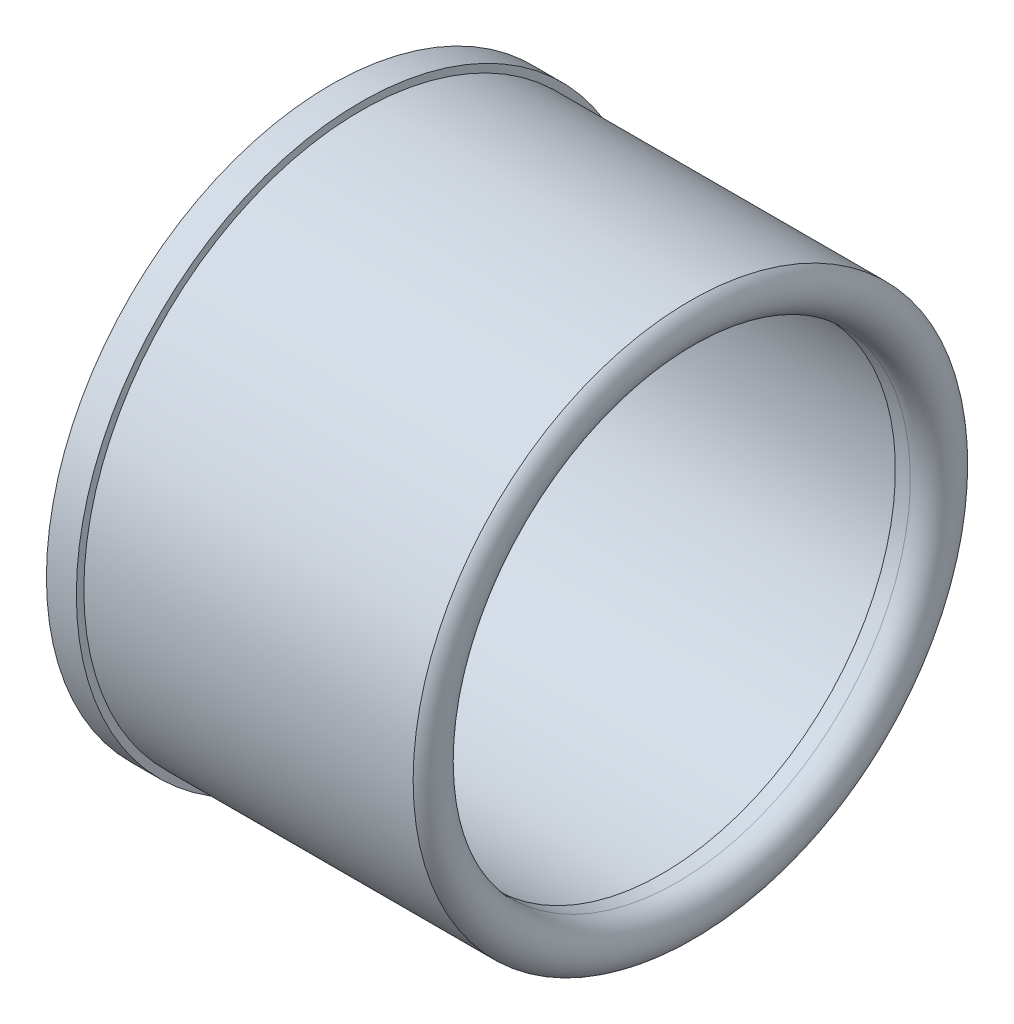
ISO-10303-21;
HEADER;
FILE_DESCRIPTION(('STEP AP214'),'2;1');
FILE_NAME('part.step','',(''),(''),'','','');
FILE_SCHEMA(('AUTOMOTIVE_DESIGN { 1 0 10303 214 1 1 1 1 }'));
ENDSEC;
DATA;
#1=APPLICATION_CONTEXT('core data for automotive mechanical design processes');
#2=APPLICATION_PROTOCOL_DEFINITION('international standard','automotive_design',2000,#1);
#3=PRODUCT_CONTEXT('',#1,'mechanical');
#4=PRODUCT('Part','Part','',(#3));
#5=PRODUCT_RELATED_PRODUCT_CATEGORY('part','',(#4));
#6=PRODUCT_DEFINITION_FORMATION('','',#4);
#7=PRODUCT_DEFINITION_CONTEXT('part definition',#1,'design');
#8=PRODUCT_DEFINITION('design','',#6,#7);
#9=PRODUCT_DEFINITION_SHAPE('','',#8);
#10=(LENGTH_UNIT() NAMED_UNIT(*) SI_UNIT(.MILLI.,.METRE.));
#11=(NAMED_UNIT(*) PLANE_ANGLE_UNIT() SI_UNIT($,.RADIAN.));
#12=(NAMED_UNIT(*) SI_UNIT($,.STERADIAN.) SOLID_ANGLE_UNIT());
#13=UNCERTAINTY_MEASURE_WITH_UNIT(LENGTH_MEASURE(1.E-05),#10,'distance_accuracy_value','');
#14=(GEOMETRIC_REPRESENTATION_CONTEXT(3) GLOBAL_UNCERTAINTY_ASSIGNED_CONTEXT((#13)) GLOBAL_UNIT_ASSIGNED_CONTEXT((#10,
#11,#12)) REPRESENTATION_CONTEXT('',''));
#15=CARTESIAN_POINT('',(0.,0.,0.));
#16=DIRECTION('',(0.,0.,1.));
#17=DIRECTION('',(1.,0.,0.));
#18=AXIS2_PLACEMENT_3D('',#15,#16,#17);
#19=CARTESIAN_POINT('',(12.1757416936097,-8.53326323507829,0.));
#20=DIRECTION('',(-1.,0.,0.));
#21=DIRECTION('',(0.,0.,1.));
#22=AXIS2_PLACEMENT_3D('',#19,#20,#21);
#23=CYLINDRICAL_SURFACE('',#22,7.8);
#24=CARTESIAN_POINT('',(11.9728126653829,-8.53326323507829,0.));
#25=DIRECTION('',(-1.,0.,0.));
#26=DIRECTION('',(0.,0.,1.));
#27=AXIS2_PLACEMENT_3D('',#24,#25,#26);
#28=CIRCLE('',#27,7.8);
#29=CARTESIAN_POINT('',(11.9728126653829,-8.53326323507829,7.8));
#30=VERTEX_POINT('',#29);
#31=EDGE_CURVE('E10',#30,#30,#28,.T.);
#32=ORIENTED_EDGE('',*,*,#31,.T.);
#33=EDGE_LOOP('',(#32));
#34=FACE_BOUND('',#33,.T.);
#35=CARTESIAN_POINT('',(12.4728126653829,-8.53326323507829,0.));
#36=DIRECTION('',(-1.,0.,0.));
#37=DIRECTION('',(0.,0.,1.));
#38=AXIS2_PLACEMENT_3D('',#35,#36,#37);
#39=CIRCLE('',#38,7.8);
#40=CARTESIAN_POINT('',(12.4728126653829,-8.53326323507829,7.8));
#41=VERTEX_POINT('',#40);
#42=EDGE_CURVE('E61',#41,#41,#39,.T.);
#43=ORIENTED_EDGE('',*,*,#42,.F.);
#44=EDGE_LOOP('',(#43));
#45=FACE_BOUND('',#44,.T.);
#46=ADVANCED_FACE('F33',(#34,#45),#23,.F.);
#47=CARTESIAN_POINT('',(11.9728126653829,-0.733263235078293,0.));
#48=DIRECTION('',(-1.,0.,0.));
#49=DIRECTION('',(0.,0.,1.));
#50=AXIS2_PLACEMENT_3D('',#47,#48,#49);
#51=PLANE('',#50);
#52=CARTESIAN_POINT('',(11.9728126653829,-8.53326323507829,0.));
#53=DIRECTION('',(-1.,0.,0.));
#54=DIRECTION('',(0.,0.,1.));
#55=AXIS2_PLACEMENT_3D('',#52,#53,#54);
#56=CIRCLE('',#55,8.05);
#57=CARTESIAN_POINT('',(11.9728126653829,-8.53326323507829,8.05));
#58=VERTEX_POINT('',#57);
#59=EDGE_CURVE('E39',#58,#58,#56,.T.);
#60=ORIENTED_EDGE('',*,*,#59,.T.);
#61=EDGE_LOOP('',(#60));
#62=FACE_BOUND('',#61,.T.);
#63=ORIENTED_EDGE('',*,*,#31,.F.);
#64=EDGE_LOOP('',(#63));
#65=FACE_BOUND('',#64,.T.);
#66=ADVANCED_FACE('F69',(#62,#65),#51,.T.);
#67=CARTESIAN_POINT('',(12.1757416936097,-8.53326323507829,0.));
#68=DIRECTION('',(-1.,0.,0.));
#69=DIRECTION('',(0.,0.,1.));
#70=AXIS2_PLACEMENT_3D('',#67,#68,#69);
#71=CYLINDRICAL_SURFACE('',#70,8.05);
#72=CARTESIAN_POINT('',(0.912123334161097,-8.53326323507829,0.));
#73=DIRECTION('',(-1.,0.,0.));
#74=DIRECTION('',(0.,0.,1.));
#75=AXIS2_PLACEMENT_3D('',#72,#73,#74);
#76=CIRCLE('',#75,8.05);
#77=CARTESIAN_POINT('',(0.912123334161097,-8.53326323507829,8.05));
#78=VERTEX_POINT('',#77);
#79=EDGE_CURVE('E43',#78,#78,#76,.T.);
#80=ORIENTED_EDGE('',*,*,#79,.T.);
#81=EDGE_LOOP('',(#80));
#82=FACE_BOUND('',#81,.T.);
#83=ORIENTED_EDGE('',*,*,#59,.F.);
#84=EDGE_LOOP('',(#83));
#85=FACE_BOUND('',#84,.T.);
#86=ADVANCED_FACE('F73',(#82,#85),#71,.F.);
#87=CARTESIAN_POINT('',(0.912123334161096,-0.483263235078293,0.));
#88=DIRECTION('',(-1.,0.,0.));
#89=DIRECTION('',(0.,0.,1.));
#90=AXIS2_PLACEMENT_3D('',#87,#88,#89);
#91=PLANE('',#90);
#92=CARTESIAN_POINT('',(0.912123334161097,-8.53326323507829,0.));
#93=DIRECTION('',(-1.,0.,0.));
#94=DIRECTION('',(0.,0.,1.));
#95=AXIS2_PLACEMENT_3D('',#92,#93,#94);
#96=CIRCLE('',#95,9.5);
#97=CARTESIAN_POINT('',(0.912123334161097,-8.53326323507829,9.5));
#98=VERTEX_POINT('',#97);
#99=EDGE_CURVE('E47',#98,#98,#96,.T.);
#100=ORIENTED_EDGE('',*,*,#99,.T.);
#101=EDGE_LOOP('',(#100));
#102=FACE_BOUND('',#101,.T.);
#103=ORIENTED_EDGE('',*,*,#79,.F.);
#104=EDGE_LOOP('',(#103));
#105=FACE_BOUND('',#104,.T.);
#106=ADVANCED_FACE('F77',(#102,#105),#91,.T.);
#107=CARTESIAN_POINT('',(12.1757416936097,-8.53326323507829,0.));
#108=DIRECTION('',(-1.,0.,0.));
#109=DIRECTION('',(0.,0.,1.));
#110=AXIS2_PLACEMENT_3D('',#107,#108,#109);
#111=CYLINDRICAL_SURFACE('',#110,9.5);
#112=CARTESIAN_POINT('',(1.9121233341611,-8.53326323507829,0.));
#113=DIRECTION('',(-1.,0.,0.));
#114=DIRECTION('',(0.,0.,1.));
#115=AXIS2_PLACEMENT_3D('',#112,#113,#114);
#116=CIRCLE('',#115,9.5);
#117=CARTESIAN_POINT('',(1.9121233341611,-8.53326323507829,9.5));
#118=VERTEX_POINT('',#117);
#119=EDGE_CURVE('E52',#118,#118,#116,.T.);
#120=ORIENTED_EDGE('',*,*,#119,.T.);
#121=EDGE_LOOP('',(#120));
#122=FACE_BOUND('',#121,.T.);
#123=ORIENTED_EDGE('',*,*,#99,.F.);
#124=EDGE_LOOP('',(#123));
#125=FACE_BOUND('',#124,.T.);
#126=ADVANCED_FACE('F84',(#122,#125),#111,.T.);
#127=CARTESIAN_POINT('',(1.9121233341611,0.966736764921707,0.));
#128=DIRECTION('',(1.,0.,0.));
#129=DIRECTION('',(0.,0.,-1.));
#130=AXIS2_PLACEMENT_3D('',#127,#128,#129);
#131=PLANE('',#130);
#132=CARTESIAN_POINT('',(1.9121233341611,-8.53326323507829,0.));
#133=DIRECTION('',(-1.,0.,0.));
#134=DIRECTION('',(0.,0.,1.));
#135=AXIS2_PLACEMENT_3D('',#132,#133,#134);
#136=CIRCLE('',#135,9.25);
#137=CARTESIAN_POINT('',(1.9121233341611,-8.53326323507829,9.25));
#138=VERTEX_POINT('',#137);
#139=EDGE_CURVE('E55',#138,#138,#136,.T.);
#140=ORIENTED_EDGE('',*,*,#139,.T.);
#141=EDGE_LOOP('',(#140));
#142=FACE_BOUND('',#141,.T.);
#143=ORIENTED_EDGE('',*,*,#119,.F.);
#144=EDGE_LOOP('',(#143));
#145=FACE_BOUND('',#144,.T.);
#146=ADVANCED_FACE('F88',(#142,#145),#131,.T.);
#147=CARTESIAN_POINT('',(12.1757416936097,-8.53326323507829,0.));
#148=DIRECTION('',(-1.,0.,0.));
#149=DIRECTION('',(0.,0.,1.));
#150=AXIS2_PLACEMENT_3D('',#147,#148,#149);
#151=CYLINDRICAL_SURFACE('',#150,9.25);
#152=CARTESIAN_POINT('',(12.9121233341611,-8.53326323507829,0.));
#153=DIRECTION('',(-1.,0.,0.));
#154=DIRECTION('',(0.,0.,1.));
#155=AXIS2_PLACEMENT_3D('',#152,#153,#154);
#156=CIRCLE('',#155,9.25);
#157=CARTESIAN_POINT('',(12.9121233341611,-8.53326323507829,9.25));
#158=VERTEX_POINT('',#157);
#159=EDGE_CURVE('E58',#158,#158,#156,.T.);
#160=ORIENTED_EDGE('',*,*,#159,.T.);
#161=EDGE_LOOP('',(#160));
#162=FACE_BOUND('',#161,.T.);
#163=ORIENTED_EDGE('',*,*,#139,.F.);
#164=EDGE_LOOP('',(#163));
#165=FACE_BOUND('',#164,.T.);
#166=ADVANCED_FACE('F92',(#162,#165),#151,.T.);
#167=CARTESIAN_POINT('',(12.4728126653829,-8.53326323507829,0.));
#168=DIRECTION('',(-1.,0.,0.));
#169=DIRECTION('',(0.,0.,1.));
#170=AXIS2_PLACEMENT_3D('',#167,#168,#169);
#171=TOROIDAL_SURFACE('',#170,8.59154960817322,0.791549608173223);
#172=ORIENTED_EDGE('',*,*,#42,.T.);
#173=EDGE_LOOP('',(#172));
#174=FACE_BOUND('',#173,.T.);
#175=ORIENTED_EDGE('',*,*,#159,.F.);
#176=EDGE_LOOP('',(#175));
#177=FACE_BOUND('',#176,.T.);
#178=ADVANCED_FACE('F65',(#174,#177),#171,.T.);
#179=CLOSED_SHELL('',(#46,#66,#86,#106,#126,#146,#166,#178));
#180=MANIFOLD_SOLID_BREP('B2',#179);
#181=ADVANCED_BREP_SHAPE_REPRESENTATION('',(#18,#180),#14);
#182=SHAPE_DEFINITION_REPRESENTATION(#9,#181);
ENDSEC;
END-ISO-10303-21;
